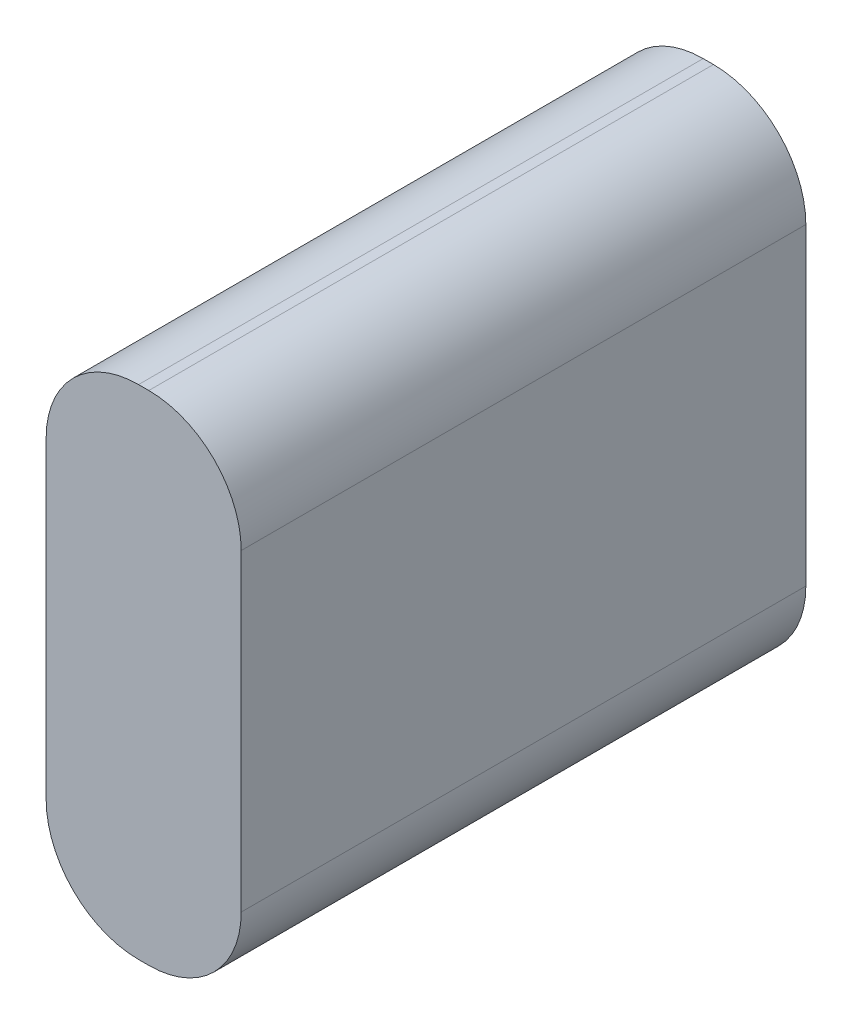
ISO-10303-21;
HEADER;
FILE_DESCRIPTION(('STEP AP214'),'2;1');
FILE_NAME('part.step','',(''),(''),'','','');
FILE_SCHEMA(('AUTOMOTIVE_DESIGN { 1 0 10303 214 1 1 1 1 }'));
ENDSEC;
DATA;
#1=APPLICATION_CONTEXT('core data for automotive mechanical design processes');
#2=APPLICATION_PROTOCOL_DEFINITION('international standard','automotive_design',2000,#1);
#3=PRODUCT_CONTEXT('',#1,'mechanical');
#4=PRODUCT('Part','Part','',(#3));
#5=PRODUCT_RELATED_PRODUCT_CATEGORY('part','',(#4));
#6=PRODUCT_DEFINITION_FORMATION('','',#4);
#7=PRODUCT_DEFINITION_CONTEXT('part definition',#1,'design');
#8=PRODUCT_DEFINITION('design','',#6,#7);
#9=PRODUCT_DEFINITION_SHAPE('','',#8);
#10=(LENGTH_UNIT() NAMED_UNIT(*) SI_UNIT(.MILLI.,.METRE.));
#11=(NAMED_UNIT(*) PLANE_ANGLE_UNIT() SI_UNIT($,.RADIAN.));
#12=(NAMED_UNIT(*) SI_UNIT($,.STERADIAN.) SOLID_ANGLE_UNIT());
#13=UNCERTAINTY_MEASURE_WITH_UNIT(LENGTH_MEASURE(1.E-05),#10,'distance_accuracy_value','');
#14=(GEOMETRIC_REPRESENTATION_CONTEXT(3) GLOBAL_UNCERTAINTY_ASSIGNED_CONTEXT((#13)) GLOBAL_UNIT_ASSIGNED_CONTEXT((#10,
#11,#12)) REPRESENTATION_CONTEXT('',''));
#15=CARTESIAN_POINT('',(0.,0.,0.));
#16=DIRECTION('',(0.,0.,1.));
#17=DIRECTION('',(1.,0.,0.));
#18=AXIS2_PLACEMENT_3D('',#15,#16,#17);
#19=CARTESIAN_POINT('',(-25.6693970012527,45.7199900379937,110.));
#20=DIRECTION('',(1.,0.,0.));
#21=DIRECTION('',(0.,1.,0.));
#22=AXIS2_PLACEMENT_3D('',#19,#20,#21);
#23=PLANE('',#22);
#24=DIRECTION('',(0.,-1.,0.));
#25=VECTOR('',#24,1.);
#26=CARTESIAN_POINT('',(-25.6693970012527,45.7199900379937,0.));
#27=LINE('',#26,#25);
#28=CARTESIAN_POINT('',(-25.6693970012527,27.7199900379938,0.));
#29=VERTEX_POINT('',#28);
#30=CARTESIAN_POINT('',(-25.6693970012527,-33.2800099620062,0.));
#31=VERTEX_POINT('',#30);
#32=EDGE_CURVE('E128',#29,#31,#27,.T.);
#33=ORIENTED_EDGE('',*,*,#32,.T.);
#34=DIRECTION('',(0.,0.,-1.));
#35=VECTOR('',#34,1.);
#36=CARTESIAN_POINT('',(-25.6693970012527,-33.2800099620063,110.));
#37=LINE('',#36,#35);
#38=CARTESIAN_POINT('',(-25.6693970012527,-33.2800099620062,110.));
#39=VERTEX_POINT('',#38);
#40=EDGE_CURVE('E151',#31,#39,#37,.F.);
#41=ORIENTED_EDGE('',*,*,#40,.T.);
#42=DIRECTION('',(0.,-1.,0.));
#43=VECTOR('',#42,1.);
#44=CARTESIAN_POINT('',(-25.6693970012527,45.7199900379937,110.));
#45=LINE('',#44,#43);
#46=CARTESIAN_POINT('',(-25.6693970012527,27.7199900379938,110.));
#47=VERTEX_POINT('',#46);
#48=EDGE_CURVE('E126',#47,#39,#45,.T.);
#49=ORIENTED_EDGE('',*,*,#48,.F.);
#50=DIRECTION('',(0.,0.,-1.));
#51=VECTOR('',#50,1.);
#52=CARTESIAN_POINT('',(-25.6693970012527,27.7199900379937,110.));
#53=LINE('',#52,#51);
#54=EDGE_CURVE('E148',#47,#29,#53,.T.);
#55=ORIENTED_EDGE('',*,*,#54,.T.);
#56=EDGE_LOOP('',(#33,#41,#49,#55));
#57=FACE_BOUND('',#56,.T.);
#58=ADVANCED_FACE('F33',(#57),#23,.F.);
#59=CARTESIAN_POINT('',(-25.6693970012527,-51.2800099620063,110.));
#60=DIRECTION('',(0.,1.,0.));
#61=DIRECTION('',(0.,0.,1.));
#62=AXIS2_PLACEMENT_3D('',#59,#60,#61);
#63=PLANE('',#62);
#64=DIRECTION('',(1.,0.,0.));
#65=VECTOR('',#64,1.);
#66=CARTESIAN_POINT('',(-25.6693970012527,-51.2800099620063,0.));
#67=LINE('',#66,#65);
#68=CARTESIAN_POINT('',(-7.66939700125274,-51.2800099620063,0.));
#69=VERTEX_POINT('',#68);
#70=CARTESIAN_POINT('',(-5.66939700125274,-51.2800099620063,0.));
#71=VERTEX_POINT('',#70);
#72=EDGE_CURVE('E124',#69,#71,#67,.T.);
#73=ORIENTED_EDGE('',*,*,#72,.T.);
#74=DIRECTION('',(0.,0.,-1.));
#75=VECTOR('',#74,1.);
#76=CARTESIAN_POINT('',(-5.66939700125274,-51.2800099620063,110.));
#77=LINE('',#76,#75);
#78=CARTESIAN_POINT('',(-5.66939700125274,-51.2800099620063,110.));
#79=VERTEX_POINT('',#78);
#80=EDGE_CURVE('E103',#71,#79,#77,.F.);
#81=ORIENTED_EDGE('',*,*,#80,.T.);
#82=DIRECTION('',(1.,0.,0.));
#83=VECTOR('',#82,1.);
#84=CARTESIAN_POINT('',(-25.6693970012527,-51.2800099620063,110.));
#85=LINE('',#84,#83);
#86=CARTESIAN_POINT('',(-7.66939700125274,-51.2800099620063,110.));
#87=VERTEX_POINT('',#86);
#88=EDGE_CURVE('E167',#87,#79,#85,.T.);
#89=ORIENTED_EDGE('',*,*,#88,.F.);
#90=DIRECTION('',(0.,0.,-1.));
#91=VECTOR('',#90,1.);
#92=CARTESIAN_POINT('',(-7.66939700125274,-51.2800099620063,110.));
#93=LINE('',#92,#91);
#94=EDGE_CURVE('E108',#87,#69,#93,.T.);
#95=ORIENTED_EDGE('',*,*,#94,.T.);
#96=EDGE_LOOP('',(#73,#81,#89,#95));
#97=FACE_BOUND('',#96,.T.);
#98=ADVANCED_FACE('F184',(#97),#63,.F.);
#99=CARTESIAN_POINT('',(12.3306029987473,45.7199900379937,110.));
#100=DIRECTION('',(-1.,0.,0.));
#101=DIRECTION('',(0.,-1.,0.));
#102=AXIS2_PLACEMENT_3D('',#99,#100,#101);
#103=PLANE('',#102);
#104=DIRECTION('',(0.,1.,0.));
#105=VECTOR('',#104,1.);
#106=CARTESIAN_POINT('',(12.3306029987473,45.7199900379937,110.));
#107=LINE('',#106,#105);
#108=CARTESIAN_POINT('',(12.3306029987473,-33.2800099620062,110.));
#109=VERTEX_POINT('',#108);
#110=CARTESIAN_POINT('',(12.3306029987473,27.7199900379938,110.));
#111=VERTEX_POINT('',#110);
#112=EDGE_CURVE('E117',#109,#111,#107,.T.);
#113=ORIENTED_EDGE('',*,*,#112,.F.);
#114=DIRECTION('',(0.,0.,-1.));
#115=VECTOR('',#114,1.);
#116=CARTESIAN_POINT('',(12.3306029987473,-33.2800099620063,110.));
#117=LINE('',#116,#115);
#118=CARTESIAN_POINT('',(12.3306029987473,-33.2800099620062,0.));
#119=VERTEX_POINT('',#118);
#120=EDGE_CURVE('E102',#109,#119,#117,.T.);
#121=ORIENTED_EDGE('',*,*,#120,.T.);
#122=DIRECTION('',(0.,1.,0.));
#123=VECTOR('',#122,1.);
#124=CARTESIAN_POINT('',(12.3306029987473,45.7199900379937,0.));
#125=LINE('',#124,#123);
#126=CARTESIAN_POINT('',(12.3306029987473,27.7199900379938,0.));
#127=VERTEX_POINT('',#126);
#128=EDGE_CURVE('E115',#119,#127,#125,.T.);
#129=ORIENTED_EDGE('',*,*,#128,.T.);
#130=DIRECTION('',(0.,0.,-1.));
#131=VECTOR('',#130,1.);
#132=CARTESIAN_POINT('',(12.3306029987473,27.7199900379937,110.));
#133=LINE('',#132,#131);
#134=EDGE_CURVE('E119',#127,#111,#133,.F.);
#135=ORIENTED_EDGE('',*,*,#134,.T.);
#136=EDGE_LOOP('',(#113,#121,#129,#135));
#137=FACE_BOUND('',#136,.T.);
#138=ADVANCED_FACE('F114',(#137),#103,.F.);
#139=CARTESIAN_POINT('',(-25.6693970012527,45.7199900379937,110.));
#140=DIRECTION('',(0.,-1.,0.));
#141=DIRECTION('',(0.,0.,-1.));
#142=AXIS2_PLACEMENT_3D('',#139,#140,#141);
#143=PLANE('',#142);
#144=DIRECTION('',(-1.,0.,0.));
#145=VECTOR('',#144,1.);
#146=CARTESIAN_POINT('',(-25.6693970012527,45.7199900379937,0.));
#147=LINE('',#146,#145);
#148=CARTESIAN_POINT('',(-5.66939700125274,45.7199900379937,0.));
#149=VERTEX_POINT('',#148);
#150=CARTESIAN_POINT('',(-7.66939700125274,45.7199900379937,0.));
#151=VERTEX_POINT('',#150);
#152=EDGE_CURVE('E123',#149,#151,#147,.T.);
#153=ORIENTED_EDGE('',*,*,#152,.T.);
#154=DIRECTION('',(0.,0.,-1.));
#155=VECTOR('',#154,1.);
#156=CARTESIAN_POINT('',(-7.66939700125274,45.7199900379937,110.));
#157=LINE('',#156,#155);
#158=CARTESIAN_POINT('',(-7.66939700125274,45.7199900379937,110.));
#159=VERTEX_POINT('',#158);
#160=EDGE_CURVE('E11',#151,#159,#157,.F.);
#161=ORIENTED_EDGE('',*,*,#160,.T.);
#162=DIRECTION('',(-1.,0.,0.));
#163=VECTOR('',#162,1.);
#164=CARTESIAN_POINT('',(-25.6693970012527,45.7199900379937,110.));
#165=LINE('',#164,#163);
#166=CARTESIAN_POINT('',(-5.66939700125274,45.7199900379937,110.));
#167=VERTEX_POINT('',#166);
#168=EDGE_CURVE('E132',#167,#159,#165,.T.);
#169=ORIENTED_EDGE('',*,*,#168,.F.);
#170=DIRECTION('',(0.,0.,-1.));
#171=VECTOR('',#170,1.);
#172=CARTESIAN_POINT('',(-5.66939700125274,45.7199900379937,110.));
#173=LINE('',#172,#171);
#174=EDGE_CURVE('E41',#167,#149,#173,.T.);
#175=ORIENTED_EDGE('',*,*,#174,.T.);
#176=EDGE_LOOP('',(#153,#161,#169,#175));
#177=FACE_BOUND('',#176,.T.);
#178=ADVANCED_FACE('F154',(#177),#143,.F.);
#179=CARTESIAN_POINT('',(0.,0.,110.));
#180=DIRECTION('',(0.,0.,1.));
#181=DIRECTION('',(1.,0.,0.));
#182=AXIS2_PLACEMENT_3D('',#179,#180,#181);
#183=PLANE('',#182);
#184=ORIENTED_EDGE('',*,*,#88,.T.);
#185=CARTESIAN_POINT('',(-5.66939700125274,-33.2800099620063,110.));
#186=DIRECTION('',(0.,0.,1.));
#187=DIRECTION('',(1.,0.,0.));
#188=AXIS2_PLACEMENT_3D('',#185,#186,#187);
#189=CIRCLE('',#188,18.);
#190=EDGE_CURVE('E146',#79,#109,#189,.T.);
#191=ORIENTED_EDGE('',*,*,#190,.T.);
#192=ORIENTED_EDGE('',*,*,#112,.T.);
#193=CARTESIAN_POINT('',(-5.66939700125274,27.7199900379937,110.));
#194=DIRECTION('',(0.,0.,1.));
#195=DIRECTION('',(1.,0.,0.));
#196=AXIS2_PLACEMENT_3D('',#193,#194,#195);
#197=CIRCLE('',#196,18.);
#198=EDGE_CURVE('E53',#111,#167,#197,.T.);
#199=ORIENTED_EDGE('',*,*,#198,.T.);
#200=ORIENTED_EDGE('',*,*,#168,.T.);
#201=CARTESIAN_POINT('',(-7.66939700125274,27.7199900379937,110.));
#202=DIRECTION('',(0.,0.,1.));
#203=DIRECTION('',(1.,0.,0.));
#204=AXIS2_PLACEMENT_3D('',#201,#202,#203);
#205=CIRCLE('',#204,18.);
#206=EDGE_CURVE('E142',#159,#47,#205,.T.);
#207=ORIENTED_EDGE('',*,*,#206,.T.);
#208=ORIENTED_EDGE('',*,*,#48,.T.);
#209=CARTESIAN_POINT('',(-7.66939700125274,-33.2800099620063,110.));
#210=DIRECTION('',(0.,0.,1.));
#211=DIRECTION('',(1.,0.,0.));
#212=AXIS2_PLACEMENT_3D('',#209,#210,#211);
#213=CIRCLE('',#212,18.);
#214=EDGE_CURVE('E144',#39,#87,#213,.T.);
#215=ORIENTED_EDGE('',*,*,#214,.T.);
#216=EDGE_LOOP('',(#184,#191,#192,#199,#200,#207,#208,#215));
#217=FACE_BOUND('',#216,.T.);
#218=ADVANCED_FACE('F173',(#217),#183,.T.);
#219=CARTESIAN_POINT('',(0.,0.,0.));
#220=DIRECTION('',(0.,0.,1.));
#221=DIRECTION('',(1.,0.,0.));
#222=AXIS2_PLACEMENT_3D('',#219,#220,#221);
#223=PLANE('',#222);
#224=ORIENTED_EDGE('',*,*,#128,.F.);
#225=CARTESIAN_POINT('',(-5.66939700125274,-33.2800099620063,0.));
#226=DIRECTION('',(0.,0.,1.));
#227=DIRECTION('',(1.,0.,0.));
#228=AXIS2_PLACEMENT_3D('',#225,#226,#227);
#229=CIRCLE('',#228,18.);
#230=EDGE_CURVE('E98',#119,#71,#229,.F.);
#231=ORIENTED_EDGE('',*,*,#230,.T.);
#232=ORIENTED_EDGE('',*,*,#72,.F.);
#233=CARTESIAN_POINT('',(-7.66939700125274,-33.2800099620063,0.));
#234=DIRECTION('',(0.,0.,1.));
#235=DIRECTION('',(1.,0.,0.));
#236=AXIS2_PLACEMENT_3D('',#233,#234,#235);
#237=CIRCLE('',#236,18.);
#238=EDGE_CURVE('E109',#69,#31,#237,.F.);
#239=ORIENTED_EDGE('',*,*,#238,.T.);
#240=ORIENTED_EDGE('',*,*,#32,.F.);
#241=CARTESIAN_POINT('',(-7.66939700125274,27.7199900379937,0.));
#242=DIRECTION('',(0.,0.,1.));
#243=DIRECTION('',(1.,0.,0.));
#244=AXIS2_PLACEMENT_3D('',#241,#242,#243);
#245=CIRCLE('',#244,18.);
#246=EDGE_CURVE('E135',#29,#151,#245,.F.);
#247=ORIENTED_EDGE('',*,*,#246,.T.);
#248=ORIENTED_EDGE('',*,*,#152,.F.);
#249=CARTESIAN_POINT('',(-5.66939700125274,27.7199900379937,0.));
#250=DIRECTION('',(0.,0.,1.));
#251=DIRECTION('',(1.,0.,0.));
#252=AXIS2_PLACEMENT_3D('',#249,#250,#251);
#253=CIRCLE('',#252,18.);
#254=EDGE_CURVE('E118',#149,#127,#253,.F.);
#255=ORIENTED_EDGE('',*,*,#254,.T.);
#256=EDGE_LOOP('',(#224,#231,#232,#239,#240,#247,#248,#255));
#257=FACE_BOUND('',#256,.T.);
#258=ADVANCED_FACE('F121',(#257),#223,.F.);
#259=CARTESIAN_POINT('',(-5.66939700125274,-33.2800099620063,110.));
#260=DIRECTION('',(0.,0.,-1.));
#261=DIRECTION('',(-1.,0.,0.));
#262=AXIS2_PLACEMENT_3D('',#259,#260,#261);
#263=CYLINDRICAL_SURFACE('',#262,18.);
#264=ORIENTED_EDGE('',*,*,#190,.F.);
#265=ORIENTED_EDGE('',*,*,#80,.F.);
#266=ORIENTED_EDGE('',*,*,#230,.F.);
#267=ORIENTED_EDGE('',*,*,#120,.F.);
#268=EDGE_LOOP('',(#264,#265,#266,#267));
#269=FACE_BOUND('',#268,.T.);
#270=ADVANCED_FACE('F101',(#269),#263,.T.);
#271=CARTESIAN_POINT('',(-7.66939700125274,-33.2800099620063,110.));
#272=DIRECTION('',(0.,0.,-1.));
#273=DIRECTION('',(-1.,0.,0.));
#274=AXIS2_PLACEMENT_3D('',#271,#272,#273);
#275=CYLINDRICAL_SURFACE('',#274,18.);
#276=ORIENTED_EDGE('',*,*,#214,.F.);
#277=ORIENTED_EDGE('',*,*,#40,.F.);
#278=ORIENTED_EDGE('',*,*,#238,.F.);
#279=ORIENTED_EDGE('',*,*,#94,.F.);
#280=EDGE_LOOP('',(#276,#277,#278,#279));
#281=FACE_BOUND('',#280,.T.);
#282=ADVANCED_FACE('F195',(#281),#275,.T.);
#283=CARTESIAN_POINT('',(-7.66939700125274,27.7199900379937,110.));
#284=DIRECTION('',(0.,0.,-1.));
#285=DIRECTION('',(-1.,0.,0.));
#286=AXIS2_PLACEMENT_3D('',#283,#284,#285);
#287=CYLINDRICAL_SURFACE('',#286,18.);
#288=ORIENTED_EDGE('',*,*,#206,.F.);
#289=ORIENTED_EDGE('',*,*,#160,.F.);
#290=ORIENTED_EDGE('',*,*,#246,.F.);
#291=ORIENTED_EDGE('',*,*,#54,.F.);
#292=EDGE_LOOP('',(#288,#289,#290,#291));
#293=FACE_BOUND('',#292,.T.);
#294=ADVANCED_FACE('F161',(#293),#287,.T.);
#295=CARTESIAN_POINT('',(-5.66939700125274,27.7199900379937,110.));
#296=DIRECTION('',(0.,0.,-1.));
#297=DIRECTION('',(-1.,0.,0.));
#298=AXIS2_PLACEMENT_3D('',#295,#296,#297);
#299=CYLINDRICAL_SURFACE('',#298,18.);
#300=ORIENTED_EDGE('',*,*,#198,.F.);
#301=ORIENTED_EDGE('',*,*,#134,.F.);
#302=ORIENTED_EDGE('',*,*,#254,.F.);
#303=ORIENTED_EDGE('',*,*,#174,.F.);
#304=EDGE_LOOP('',(#300,#301,#302,#303));
#305=FACE_BOUND('',#304,.T.);
#306=ADVANCED_FACE('F35',(#305),#299,.T.);
#307=CLOSED_SHELL('',(#58,#98,#138,#178,#218,#258,#270,#282,#294,#306));
#308=MANIFOLD_SOLID_BREP('B2',#307);
#309=ADVANCED_BREP_SHAPE_REPRESENTATION('',(#18,#308),#14);
#310=SHAPE_DEFINITION_REPRESENTATION(#9,#309);
ENDSEC;
END-ISO-10303-21;
